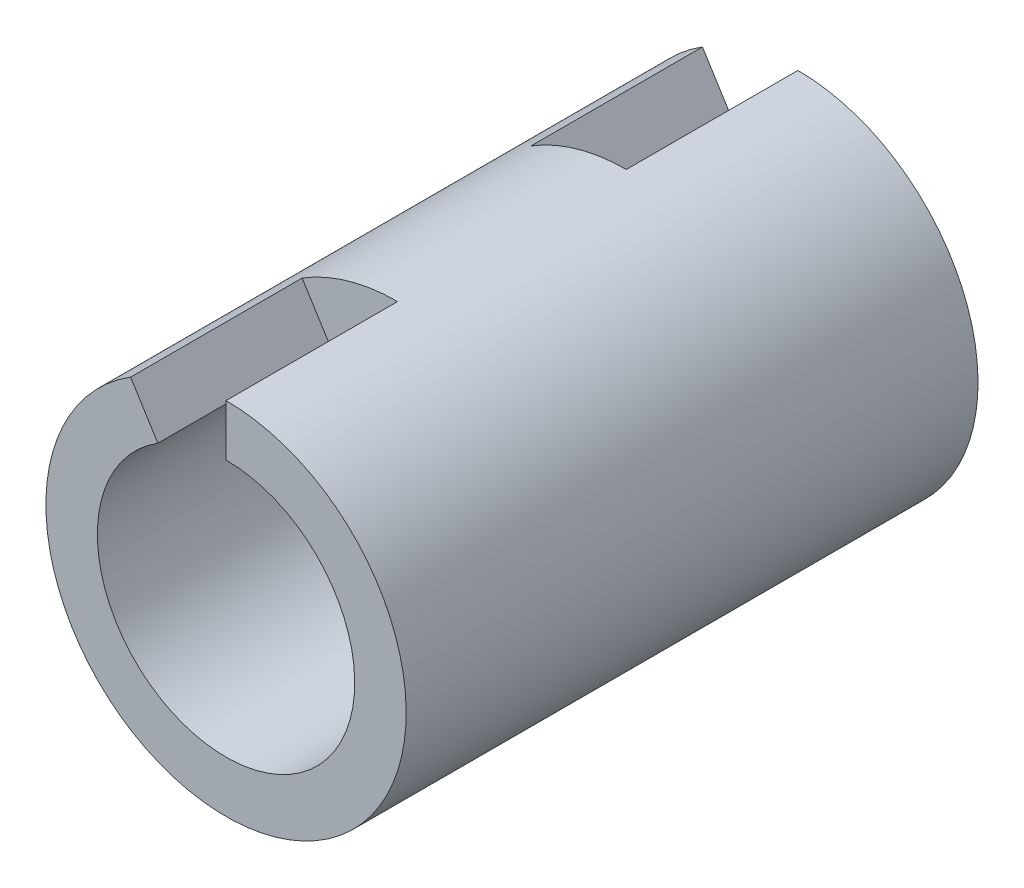
ISO-10303-21;
HEADER;
FILE_DESCRIPTION(('STEP AP214'),'2;1');
FILE_NAME('part.step','',(''),(''),'','','');
FILE_SCHEMA(('AUTOMOTIVE_DESIGN { 1 0 10303 214 1 1 1 1 }'));
ENDSEC;
DATA;
#1=APPLICATION_CONTEXT('core data for automotive mechanical design processes');
#2=APPLICATION_PROTOCOL_DEFINITION('international standard','automotive_design',2000,#1);
#3=PRODUCT_CONTEXT('',#1,'mechanical');
#4=PRODUCT('Part','Part','',(#3));
#5=PRODUCT_RELATED_PRODUCT_CATEGORY('part','',(#4));
#6=PRODUCT_DEFINITION_FORMATION('','',#4);
#7=PRODUCT_DEFINITION_CONTEXT('part definition',#1,'design');
#8=PRODUCT_DEFINITION('design','',#6,#7);
#9=PRODUCT_DEFINITION_SHAPE('','',#8);
#10=(LENGTH_UNIT() NAMED_UNIT(*) SI_UNIT(.MILLI.,.METRE.));
#11=(NAMED_UNIT(*) PLANE_ANGLE_UNIT() SI_UNIT($,.RADIAN.));
#12=(NAMED_UNIT(*) SI_UNIT($,.STERADIAN.) SOLID_ANGLE_UNIT());
#13=UNCERTAINTY_MEASURE_WITH_UNIT(LENGTH_MEASURE(1.E-05),#10,'distance_accuracy_value','');
#14=(GEOMETRIC_REPRESENTATION_CONTEXT(3) GLOBAL_UNCERTAINTY_ASSIGNED_CONTEXT((#13)) GLOBAL_UNIT_ASSIGNED_CONTEXT((#10,
#11,#12)) REPRESENTATION_CONTEXT('',''));
#15=CARTESIAN_POINT('',(0.,0.,0.));
#16=DIRECTION('',(0.,0.,1.));
#17=DIRECTION('',(1.,0.,0.));
#18=AXIS2_PLACEMENT_3D('',#15,#16,#17);
#19=CARTESIAN_POINT('',(0.,0.,-10.));
#20=DIRECTION('',(0.,0.,1.));
#21=DIRECTION('',(1.,0.,0.));
#22=AXIS2_PLACEMENT_3D('',#19,#20,#21);
#23=PLANE('',#22);
#24=CARTESIAN_POINT('',(0.,0.,-10.));
#25=DIRECTION('',(0.,0.,-1.));
#26=DIRECTION('',(-1.,0.,0.));
#27=AXIS2_PLACEMENT_3D('',#24,#25,#26);
#28=CIRCLE('',#27,6.3);
#29=CARTESIAN_POINT('',(0.,6.3,-10.));
#30=VERTEX_POINT('',#29);
#31=CARTESIAN_POINT('',(-3.33849136466916,5.3427030057855,-10.));
#32=VERTEX_POINT('',#31);
#33=EDGE_CURVE('E114',#30,#32,#28,.T.);
#34=ORIENTED_EDGE('',*,*,#33,.T.);
#35=DIRECTION('',(0.5299192642332,-0.848048096156429,0.));
#36=VECTOR('',#35,1.);
#37=CARTESIAN_POINT('',(-6.23004048300337,9.970148902274,-10.));
#38=LINE('',#37,#36);
#39=CARTESIAN_POINT('',(-2.3846366890494,3.81621643270393,-10.));
#40=VERTEX_POINT('',#39);
#41=EDGE_CURVE('E104',#32,#40,#38,.T.);
#42=ORIENTED_EDGE('',*,*,#41,.T.);
#43=CARTESIAN_POINT('',(0.,0.,-10.));
#44=DIRECTION('',(0.,0.,1.));
#45=DIRECTION('',(1.,0.,0.));
#46=AXIS2_PLACEMENT_3D('',#43,#44,#45);
#47=CIRCLE('',#46,4.5);
#48=CARTESIAN_POINT('',(0.,4.5,-10.));
#49=VERTEX_POINT('',#48);
#50=EDGE_CURVE('E123',#40,#49,#47,.T.);
#51=ORIENTED_EDGE('',*,*,#50,.T.);
#52=DIRECTION('',(0.,1.,0.));
#53=VECTOR('',#52,1.);
#54=CARTESIAN_POINT('',(0.,0.,-10.));
#55=LINE('',#54,#53);
#56=EDGE_CURVE('E159',#49,#30,#55,.T.);
#57=ORIENTED_EDGE('',*,*,#56,.T.);
#58=EDGE_LOOP('',(#34,#42,#51,#57));
#59=FACE_BOUND('',#58,.T.);
#60=ADVANCED_FACE('F35',(#59),#23,.F.);
#61=CARTESIAN_POINT('',(0.,0.,10.));
#62=DIRECTION('',(0.,0.,1.));
#63=DIRECTION('',(1.,0.,0.));
#64=AXIS2_PLACEMENT_3D('',#61,#62,#63);
#65=PLANE('',#64);
#66=DIRECTION('',(0.5299192642332,-0.848048096156429,0.));
#67=VECTOR('',#66,1.);
#68=CARTESIAN_POINT('',(0.,0.,10.));
#69=LINE('',#68,#67);
#70=CARTESIAN_POINT('',(-3.33849136466916,5.3427030057855,10.));
#71=VERTEX_POINT('',#70);
#72=CARTESIAN_POINT('',(-2.3846366890494,3.81621643270393,10.));
#73=VERTEX_POINT('',#72);
#74=EDGE_CURVE('E113',#71,#73,#69,.T.);
#75=ORIENTED_EDGE('',*,*,#74,.F.);
#76=CARTESIAN_POINT('',(0.,0.,10.));
#77=DIRECTION('',(0.,0.,-1.));
#78=DIRECTION('',(-1.,0.,0.));
#79=AXIS2_PLACEMENT_3D('',#76,#77,#78);
#80=CIRCLE('',#79,6.3);
#81=CARTESIAN_POINT('',(0.,6.3,10.));
#82=VERTEX_POINT('',#81);
#83=EDGE_CURVE('E49',#82,#71,#80,.T.);
#84=ORIENTED_EDGE('',*,*,#83,.F.);
#85=DIRECTION('',(0.,1.,0.));
#86=VECTOR('',#85,1.);
#87=CARTESIAN_POINT('',(0.,0.,10.));
#88=LINE('',#87,#86);
#89=CARTESIAN_POINT('',(0.,4.5,10.));
#90=VERTEX_POINT('',#89);
#91=EDGE_CURVE('E111',#90,#82,#88,.T.);
#92=ORIENTED_EDGE('',*,*,#91,.F.);
#93=CARTESIAN_POINT('',(0.,0.,10.));
#94=DIRECTION('',(0.,0.,1.));
#95=DIRECTION('',(1.,0.,0.));
#96=AXIS2_PLACEMENT_3D('',#93,#94,#95);
#97=CIRCLE('',#96,4.5);
#98=EDGE_CURVE('E147',#73,#90,#97,.T.);
#99=ORIENTED_EDGE('',*,*,#98,.F.);
#100=EDGE_LOOP('',(#75,#84,#92,#99));
#101=FACE_BOUND('',#100,.T.);
#102=ADVANCED_FACE('F109',(#101),#65,.T.);
#103=CARTESIAN_POINT('',(0.,0.,4.));
#104=DIRECTION('',(0.,0.,1.));
#105=DIRECTION('',(1.,0.,0.));
#106=AXIS2_PLACEMENT_3D('',#103,#104,#105);
#107=PLANE('',#106);
#108=DIRECTION('',(0.,1.,0.));
#109=VECTOR('',#108,1.);
#110=CARTESIAN_POINT('',(0.,0.,4.));
#111=LINE('',#110,#109);
#112=CARTESIAN_POINT('',(0.,4.5,4.));
#113=VERTEX_POINT('',#112);
#114=CARTESIAN_POINT('',(0.,6.3,4.));
#115=VERTEX_POINT('',#114);
#116=EDGE_CURVE('E154',#113,#115,#111,.T.);
#117=ORIENTED_EDGE('',*,*,#116,.T.);
#118=CARTESIAN_POINT('',(0.,0.,4.));
#119=DIRECTION('',(0.,0.,1.));
#120=DIRECTION('',(1.,0.,0.));
#121=AXIS2_PLACEMENT_3D('',#118,#119,#120);
#122=CIRCLE('',#121,6.3);
#123=CARTESIAN_POINT('',(-3.33849136466916,5.3427030057855,4.));
#124=VERTEX_POINT('',#123);
#125=EDGE_CURVE('E99',#115,#124,#122,.T.);
#126=ORIENTED_EDGE('',*,*,#125,.T.);
#127=DIRECTION('',(0.5299192642332,-0.848048096156429,0.));
#128=VECTOR('',#127,1.);
#129=CARTESIAN_POINT('',(-6.23004048300337,9.970148902274,4.));
#130=LINE('',#129,#128);
#131=CARTESIAN_POINT('',(-2.3846366890494,3.81621643270393,4.));
#132=VERTEX_POINT('',#131);
#133=EDGE_CURVE('E156',#124,#132,#130,.T.);
#134=ORIENTED_EDGE('',*,*,#133,.T.);
#135=CARTESIAN_POINT('',(0.,0.,4.));
#136=DIRECTION('',(0.,0.,1.));
#137=DIRECTION('',(1.,0.,0.));
#138=AXIS2_PLACEMENT_3D('',#135,#136,#137);
#139=CIRCLE('',#138,4.5);
#140=EDGE_CURVE('E119',#132,#113,#139,.F.);
#141=ORIENTED_EDGE('',*,*,#140,.T.);
#142=EDGE_LOOP('',(#117,#126,#134,#141));
#143=FACE_BOUND('',#142,.T.);
#144=ADVANCED_FACE('F189',(#143),#107,.T.);
#145=CARTESIAN_POINT('',(0.,0.,4.));
#146=DIRECTION('',(1.,0.,0.));
#147=DIRECTION('',(0.,0.,-1.));
#148=AXIS2_PLACEMENT_3D('',#145,#146,#147);
#149=PLANE('',#148);
#150=DIRECTION('',(0.,0.,-1.));
#151=VECTOR('',#150,1.);
#152=CARTESIAN_POINT('',(0.,6.3,10.));
#153=LINE('',#152,#151);
#154=EDGE_CURVE('E96',#115,#82,#153,.F.);
#155=ORIENTED_EDGE('',*,*,#154,.F.);
#156=ORIENTED_EDGE('',*,*,#116,.F.);
#157=DIRECTION('',(0.,0.,1.));
#158=VECTOR('',#157,1.);
#159=CARTESIAN_POINT('',(0.,4.5,-10.));
#160=LINE('',#159,#158);
#161=EDGE_CURVE('E118',#90,#113,#160,.F.);
#162=ORIENTED_EDGE('',*,*,#161,.F.);
#163=ORIENTED_EDGE('',*,*,#91,.T.);
#164=EDGE_LOOP('',(#155,#156,#162,#163));
#165=FACE_BOUND('',#164,.T.);
#166=ADVANCED_FACE('F116',(#165),#149,.F.);
#167=CARTESIAN_POINT('',(-6.23004048300337,9.970148902274,4.));
#168=DIRECTION('',(-0.848048096156429,-0.5299192642332,0.));
#169=DIRECTION('',(0.5299192642332,-0.848048096156429,0.));
#170=AXIS2_PLACEMENT_3D('',#167,#168,#169);
#171=PLANE('',#170);
#172=DIRECTION('',(0.,0.,-1.));
#173=VECTOR('',#172,1.);
#174=CARTESIAN_POINT('',(-3.33849136466916,5.3427030057855,10.));
#175=LINE('',#174,#173);
#176=EDGE_CURVE('E166',#71,#124,#175,.T.);
#177=ORIENTED_EDGE('',*,*,#176,.F.);
#178=ORIENTED_EDGE('',*,*,#74,.T.);
#179=DIRECTION('',(0.,0.,1.));
#180=VECTOR('',#179,1.);
#181=CARTESIAN_POINT('',(-2.3846366890494,3.81621643270393,-10.));
#182=LINE('',#181,#180);
#183=EDGE_CURVE('E151',#132,#73,#182,.T.);
#184=ORIENTED_EDGE('',*,*,#183,.F.);
#185=ORIENTED_EDGE('',*,*,#133,.F.);
#186=EDGE_LOOP('',(#177,#178,#184,#185));
#187=FACE_BOUND('',#186,.T.);
#188=ADVANCED_FACE('F197',(#187),#171,.F.);
#189=CARTESIAN_POINT('',(-6.23004048300337,9.970148902274,-4.));
#190=DIRECTION('',(0.848048096156429,0.5299192642332,0.));
#191=DIRECTION('',(-0.5299192642332,0.848048096156429,0.));
#192=AXIS2_PLACEMENT_3D('',#189,#190,#191);
#193=PLANE('',#192);
#194=ORIENTED_EDGE('',*,*,#41,.F.);
#195=DIRECTION('',(0.,0.,-1.));
#196=VECTOR('',#195,1.);
#197=CARTESIAN_POINT('',(-3.33849136466916,5.3427030057855,10.));
#198=LINE('',#197,#196);
#199=CARTESIAN_POINT('',(-3.33849136466916,5.3427030057855,-4.));
#200=VERTEX_POINT('',#199);
#201=EDGE_CURVE('E168',#32,#200,#198,.F.);
#202=ORIENTED_EDGE('',*,*,#201,.T.);
#203=DIRECTION('',(0.5299192642332,-0.848048096156429,0.));
#204=VECTOR('',#203,1.);
#205=CARTESIAN_POINT('',(-6.23004048300337,9.970148902274,-4.));
#206=LINE('',#205,#204);
#207=CARTESIAN_POINT('',(-2.3846366890494,3.81621643270393,-4.));
#208=VERTEX_POINT('',#207);
#209=EDGE_CURVE('E139',#200,#208,#206,.T.);
#210=ORIENTED_EDGE('',*,*,#209,.T.);
#211=DIRECTION('',(0.,0.,1.));
#212=VECTOR('',#211,1.);
#213=CARTESIAN_POINT('',(-2.3846366890494,3.81621643270393,-10.));
#214=LINE('',#213,#212);
#215=EDGE_CURVE('E42',#208,#40,#214,.F.);
#216=ORIENTED_EDGE('',*,*,#215,.T.);
#217=EDGE_LOOP('',(#194,#202,#210,#216));
#218=FACE_BOUND('',#217,.T.);
#219=ADVANCED_FACE('F136',(#218),#193,.T.);
#220=CARTESIAN_POINT('',(0.,0.,-4.));
#221=DIRECTION('',(-1.,0.,0.));
#222=DIRECTION('',(0.,0.,1.));
#223=AXIS2_PLACEMENT_3D('',#220,#221,#222);
#224=PLANE('',#223);
#225=DIRECTION('',(0.,1.,0.));
#226=VECTOR('',#225,1.);
#227=CARTESIAN_POINT('',(0.,0.,-4.));
#228=LINE('',#227,#226);
#229=CARTESIAN_POINT('',(0.,4.5,-4.));
#230=VERTEX_POINT('',#229);
#231=CARTESIAN_POINT('',(0.,6.3,-4.));
#232=VERTEX_POINT('',#231);
#233=EDGE_CURVE('E158',#230,#232,#228,.T.);
#234=ORIENTED_EDGE('',*,*,#233,.T.);
#235=DIRECTION('',(0.,0.,-1.));
#236=VECTOR('',#235,1.);
#237=CARTESIAN_POINT('',(0.,6.3,10.));
#238=LINE('',#237,#236);
#239=EDGE_CURVE('E56',#232,#30,#238,.T.);
#240=ORIENTED_EDGE('',*,*,#239,.T.);
#241=ORIENTED_EDGE('',*,*,#56,.F.);
#242=DIRECTION('',(0.,0.,1.));
#243=VECTOR('',#242,1.);
#244=CARTESIAN_POINT('',(0.,4.5,-10.));
#245=LINE('',#244,#243);
#246=EDGE_CURVE('E129',#49,#230,#245,.T.);
#247=ORIENTED_EDGE('',*,*,#246,.T.);
#248=EDGE_LOOP('',(#234,#240,#241,#247));
#249=FACE_BOUND('',#248,.T.);
#250=ADVANCED_FACE('F173',(#249),#224,.T.);
#251=CARTESIAN_POINT('',(0.,0.,-4.));
#252=DIRECTION('',(0.,0.,1.));
#253=DIRECTION('',(1.,0.,0.));
#254=AXIS2_PLACEMENT_3D('',#251,#252,#253);
#255=PLANE('',#254);
#256=CARTESIAN_POINT('',(0.,0.,-4.));
#257=DIRECTION('',(0.,0.,1.));
#258=DIRECTION('',(1.,0.,0.));
#259=AXIS2_PLACEMENT_3D('',#256,#257,#258);
#260=CIRCLE('',#259,6.3);
#261=EDGE_CURVE('E11',#232,#200,#260,.T.);
#262=ORIENTED_EDGE('',*,*,#261,.F.);
#263=ORIENTED_EDGE('',*,*,#233,.F.);
#264=CARTESIAN_POINT('',(0.,0.,-4.));
#265=DIRECTION('',(0.,0.,1.));
#266=DIRECTION('',(1.,0.,0.));
#267=AXIS2_PLACEMENT_3D('',#264,#265,#266);
#268=CIRCLE('',#267,4.5);
#269=EDGE_CURVE('E121',#208,#230,#268,.F.);
#270=ORIENTED_EDGE('',*,*,#269,.F.);
#271=ORIENTED_EDGE('',*,*,#209,.F.);
#272=EDGE_LOOP('',(#262,#263,#270,#271));
#273=FACE_BOUND('',#272,.T.);
#274=ADVANCED_FACE('F175',(#273),#255,.F.);
#275=CARTESIAN_POINT('',(0.,0.,-10.));
#276=DIRECTION('',(0.,0.,1.));
#277=DIRECTION('',(1.,0.,0.));
#278=AXIS2_PLACEMENT_3D('',#275,#276,#277);
#279=CYLINDRICAL_SURFACE('',#278,4.5);
#280=ORIENTED_EDGE('',*,*,#98,.T.);
#281=ORIENTED_EDGE('',*,*,#161,.T.);
#282=ORIENTED_EDGE('',*,*,#140,.F.);
#283=ORIENTED_EDGE('',*,*,#183,.T.);
#284=EDGE_LOOP('',(#280,#281,#282,#283));
#285=FACE_BOUND('',#284,.T.);
#286=ORIENTED_EDGE('',*,*,#215,.F.);
#287=ORIENTED_EDGE('',*,*,#269,.T.);
#288=ORIENTED_EDGE('',*,*,#246,.F.);
#289=ORIENTED_EDGE('',*,*,#50,.F.);
#290=EDGE_LOOP('',(#286,#287,#288,#289));
#291=FACE_BOUND('',#290,.T.);
#292=ADVANCED_FACE('F144',(#285,#291),#279,.F.);
#293=CARTESIAN_POINT('',(0.,0.,10.));
#294=DIRECTION('',(0.,0.,-1.));
#295=DIRECTION('',(-1.,0.,0.));
#296=AXIS2_PLACEMENT_3D('',#293,#294,#295);
#297=CYLINDRICAL_SURFACE('',#296,6.3);
#298=ORIENTED_EDGE('',*,*,#33,.F.);
#299=ORIENTED_EDGE('',*,*,#239,.F.);
#300=ORIENTED_EDGE('',*,*,#261,.T.);
#301=ORIENTED_EDGE('',*,*,#201,.F.);
#302=EDGE_LOOP('',(#298,#299,#300,#301));
#303=FACE_BOUND('',#302,.T.);
#304=ORIENTED_EDGE('',*,*,#154,.T.);
#305=ORIENTED_EDGE('',*,*,#83,.T.);
#306=ORIENTED_EDGE('',*,*,#176,.T.);
#307=ORIENTED_EDGE('',*,*,#125,.F.);
#308=EDGE_LOOP('',(#304,#305,#306,#307));
#309=FACE_BOUND('',#308,.T.);
#310=ADVANCED_FACE('F97',(#303,#309),#297,.T.);
#311=CLOSED_SHELL('',(#60,#102,#144,#166,#188,#219,#250,#274,#292,#310));
#312=MANIFOLD_SOLID_BREP('B2',#311);
#313=ADVANCED_BREP_SHAPE_REPRESENTATION('',(#18,#312),#14);
#314=SHAPE_DEFINITION_REPRESENTATION(#9,#313);
ENDSEC;
END-ISO-10303-21;
